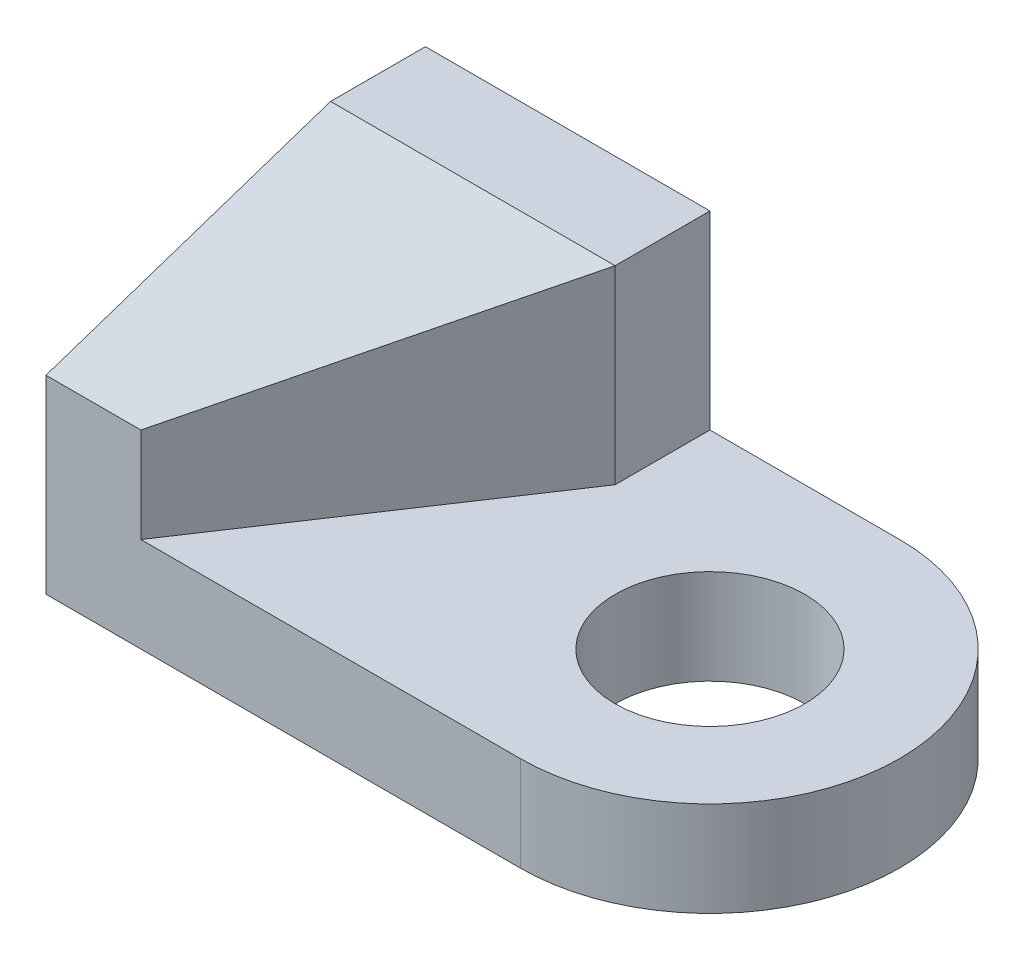
ISO-10303-21;
HEADER;
FILE_DESCRIPTION(('STEP AP214'),'2;1');
FILE_NAME('part.step','',(''),(''),'','','');
FILE_SCHEMA(('AUTOMOTIVE_DESIGN { 1 0 10303 214 1 1 1 1 }'));
ENDSEC;
DATA;
#1=APPLICATION_CONTEXT('core data for automotive mechanical design processes');
#2=APPLICATION_PROTOCOL_DEFINITION('international standard','automotive_design',2000,#1);
#3=PRODUCT_CONTEXT('',#1,'mechanical');
#4=PRODUCT('Part','Part','',(#3));
#5=PRODUCT_RELATED_PRODUCT_CATEGORY('part','',(#4));
#6=PRODUCT_DEFINITION_FORMATION('','',#4);
#7=PRODUCT_DEFINITION_CONTEXT('part definition',#1,'design');
#8=PRODUCT_DEFINITION('design','',#6,#7);
#9=PRODUCT_DEFINITION_SHAPE('','',#8);
#10=(LENGTH_UNIT() NAMED_UNIT(*) SI_UNIT(.MILLI.,.METRE.));
#11=(NAMED_UNIT(*) PLANE_ANGLE_UNIT() SI_UNIT($,.RADIAN.));
#12=(NAMED_UNIT(*) SI_UNIT($,.STERADIAN.) SOLID_ANGLE_UNIT());
#13=UNCERTAINTY_MEASURE_WITH_UNIT(LENGTH_MEASURE(1.E-05),#10,'distance_accuracy_value','');
#14=(GEOMETRIC_REPRESENTATION_CONTEXT(3) GLOBAL_UNCERTAINTY_ASSIGNED_CONTEXT((#13)) GLOBAL_UNIT_ASSIGNED_CONTEXT((#10,
#11,#12)) REPRESENTATION_CONTEXT('',''));
#15=CARTESIAN_POINT('',(0.,0.,0.));
#16=DIRECTION('',(0.,0.,1.));
#17=DIRECTION('',(1.,0.,0.));
#18=AXIS2_PLACEMENT_3D('',#15,#16,#17);
#19=CARTESIAN_POINT('',(25.,5.,10.));
#20=DIRECTION('',(0.,-1.,0.));
#21=DIRECTION('',(0.,0.,-1.));
#22=AXIS2_PLACEMENT_3D('',#19,#20,#21);
#23=PLANE('',#22);
#24=CARTESIAN_POINT('',(25.,5.,10.));
#25=DIRECTION('',(0.,1.,0.));
#26=DIRECTION('',(0.,0.,1.));
#27=AXIS2_PLACEMENT_3D('',#24,#25,#26);
#28=CIRCLE('',#27,5.);
#29=CARTESIAN_POINT('',(25.,5.,15.));
#30=VERTEX_POINT('',#29);
#31=EDGE_CURVE('E128',#30,#30,#28,.T.);
#32=ORIENTED_EDGE('',*,*,#31,.F.);
#33=EDGE_LOOP('',(#32));
#34=FACE_BOUND('',#33,.T.);
#35=DIRECTION('',(0.554700196225229,0.,-0.832050294337844));
#36=VECTOR('',#35,1.);
#37=CARTESIAN_POINT('',(15.,5.,5.));
#38=LINE('',#37,#36);
#39=CARTESIAN_POINT('',(5.,5.,20.));
#40=VERTEX_POINT('',#39);
#41=CARTESIAN_POINT('',(15.,5.,5.));
#42=VERTEX_POINT('',#41);
#43=EDGE_CURVE('E114',#40,#42,#38,.T.);
#44=ORIENTED_EDGE('',*,*,#43,.F.);
#45=DIRECTION('',(1.,0.,0.));
#46=VECTOR('',#45,1.);
#47=CARTESIAN_POINT('',(0.,5.,20.));
#48=LINE('',#47,#46);
#49=CARTESIAN_POINT('',(25.,5.,20.));
#50=VERTEX_POINT('',#49);
#51=EDGE_CURVE('E134',#40,#50,#48,.T.);
#52=ORIENTED_EDGE('',*,*,#51,.T.);
#53=CARTESIAN_POINT('',(25.,5.,10.));
#54=DIRECTION('',(0.,1.,0.));
#55=DIRECTION('',(0.,0.,-1.));
#56=AXIS2_PLACEMENT_3D('',#53,#54,#55);
#57=CIRCLE('',#56,10.);
#58=CARTESIAN_POINT('',(25.,5.,0.));
#59=VERTEX_POINT('',#58);
#60=EDGE_CURVE('E136',#50,#59,#57,.T.);
#61=ORIENTED_EDGE('',*,*,#60,.T.);
#62=DIRECTION('',(-1.,0.,0.));
#63=VECTOR('',#62,1.);
#64=CARTESIAN_POINT('',(0.,5.,0.));
#65=LINE('',#64,#63);
#66=CARTESIAN_POINT('',(15.,5.,0.));
#67=VERTEX_POINT('',#66);
#68=EDGE_CURVE('E139',#59,#67,#65,.T.);
#69=ORIENTED_EDGE('',*,*,#68,.T.);
#70=DIRECTION('',(0.,0.,-1.));
#71=VECTOR('',#70,1.);
#72=CARTESIAN_POINT('',(15.,5.,5.));
#73=LINE('',#72,#71);
#74=EDGE_CURVE('E55',#42,#67,#73,.T.);
#75=ORIENTED_EDGE('',*,*,#74,.F.);
#76=EDGE_LOOP('',(#44,#52,#61,#69,#75));
#77=FACE_BOUND('',#76,.T.);
#78=ADVANCED_FACE('F33',(#34,#77),#23,.F.);
#79=CARTESIAN_POINT('',(25.,0.,10.));
#80=DIRECTION('',(0.,-1.,0.));
#81=DIRECTION('',(0.,0.,-1.));
#82=AXIS2_PLACEMENT_3D('',#79,#80,#81);
#83=PLANE('',#82);
#84=DIRECTION('',(0.,0.,1.));
#85=VECTOR('',#84,1.);
#86=CARTESIAN_POINT('',(0.,0.,0.));
#87=LINE('',#86,#85);
#88=CARTESIAN_POINT('',(0.,0.,0.));
#89=VERTEX_POINT('',#88);
#90=CARTESIAN_POINT('',(0.,0.,20.));
#91=VERTEX_POINT('',#90);
#92=EDGE_CURVE('E131',#89,#91,#87,.T.);
#93=ORIENTED_EDGE('',*,*,#92,.F.);
#94=DIRECTION('',(-1.,0.,0.));
#95=VECTOR('',#94,1.);
#96=CARTESIAN_POINT('',(0.,0.,0.));
#97=LINE('',#96,#95);
#98=CARTESIAN_POINT('',(25.,0.,0.));
#99=VERTEX_POINT('',#98);
#100=EDGE_CURVE('E137',#99,#89,#97,.T.);
#101=ORIENTED_EDGE('',*,*,#100,.F.);
#102=CARTESIAN_POINT('',(25.,0.,10.));
#103=DIRECTION('',(0.,1.,0.));
#104=DIRECTION('',(0.,0.,-1.));
#105=AXIS2_PLACEMENT_3D('',#102,#103,#104);
#106=CIRCLE('',#105,10.);
#107=CARTESIAN_POINT('',(25.,0.,20.));
#108=VERTEX_POINT('',#107);
#109=EDGE_CURVE('E145',#108,#99,#106,.T.);
#110=ORIENTED_EDGE('',*,*,#109,.F.);
#111=DIRECTION('',(1.,0.,0.));
#112=VECTOR('',#111,1.);
#113=CARTESIAN_POINT('',(0.,0.,20.));
#114=LINE('',#113,#112);
#115=EDGE_CURVE('E143',#91,#108,#114,.T.);
#116=ORIENTED_EDGE('',*,*,#115,.F.);
#117=EDGE_LOOP('',(#93,#101,#110,#116));
#118=FACE_BOUND('',#117,.T.);
#119=CARTESIAN_POINT('',(25.,0.,10.));
#120=DIRECTION('',(0.,1.,0.));
#121=DIRECTION('',(0.,0.,1.));
#122=AXIS2_PLACEMENT_3D('',#119,#120,#121);
#123=CIRCLE('',#122,5.);
#124=CARTESIAN_POINT('',(25.,0.,15.));
#125=VERTEX_POINT('',#124);
#126=EDGE_CURVE('E127',#125,#125,#123,.T.);
#127=ORIENTED_EDGE('',*,*,#126,.T.);
#128=EDGE_LOOP('',(#127));
#129=FACE_BOUND('',#128,.T.);
#130=ADVANCED_FACE('F161',(#118,#129),#83,.T.);
#131=CARTESIAN_POINT('',(0.,5.,0.));
#132=DIRECTION('',(1.,0.,0.));
#133=DIRECTION('',(0.,0.,-1.));
#134=AXIS2_PLACEMENT_3D('',#131,#132,#133);
#135=PLANE('',#134);
#136=DIRECTION('',(0.,-1.,0.));
#137=VECTOR('',#136,1.);
#138=CARTESIAN_POINT('',(0.,5.,20.));
#139=LINE('',#138,#137);
#140=CARTESIAN_POINT('',(0.,10.,20.));
#141=VERTEX_POINT('',#140);
#142=EDGE_CURVE('E41',#141,#91,#139,.T.);
#143=ORIENTED_EDGE('',*,*,#142,.F.);
#144=DIRECTION('',(0.,-0.316227766016838,0.948683298050514));
#145=VECTOR('',#144,1.);
#146=CARTESIAN_POINT('',(0.,15.,5.));
#147=LINE('',#146,#145);
#148=CARTESIAN_POINT('',(0.,15.,5.));
#149=VERTEX_POINT('',#148);
#150=EDGE_CURVE('E95',#149,#141,#147,.T.);
#151=ORIENTED_EDGE('',*,*,#150,.F.);
#152=DIRECTION('',(0.,0.,1.));
#153=VECTOR('',#152,1.);
#154=CARTESIAN_POINT('',(0.,15.,5.));
#155=LINE('',#154,#153);
#156=CARTESIAN_POINT('',(0.,15.,0.));
#157=VERTEX_POINT('',#156);
#158=EDGE_CURVE('E104',#157,#149,#155,.T.);
#159=ORIENTED_EDGE('',*,*,#158,.F.);
#160=DIRECTION('',(0.,-1.,0.));
#161=VECTOR('',#160,1.);
#162=CARTESIAN_POINT('',(0.,5.,0.));
#163=LINE('',#162,#161);
#164=EDGE_CURVE('E141',#157,#89,#163,.T.);
#165=ORIENTED_EDGE('',*,*,#164,.T.);
#166=ORIENTED_EDGE('',*,*,#92,.T.);
#167=EDGE_LOOP('',(#143,#151,#159,#165,#166));
#168=FACE_BOUND('',#167,.T.);
#169=ADVANCED_FACE('F35',(#168),#135,.F.);
#170=CARTESIAN_POINT('',(0.,5.,20.));
#171=DIRECTION('',(0.,0.,-1.));
#172=DIRECTION('',(-1.,0.,0.));
#173=AXIS2_PLACEMENT_3D('',#170,#171,#172);
#174=PLANE('',#173);
#175=DIRECTION('',(0.,1.,0.));
#176=VECTOR('',#175,1.);
#177=CARTESIAN_POINT('',(5.,5.,20.));
#178=LINE('',#177,#176);
#179=CARTESIAN_POINT('',(5.,10.,20.));
#180=VERTEX_POINT('',#179);
#181=EDGE_CURVE('E124',#40,#180,#178,.T.);
#182=ORIENTED_EDGE('',*,*,#181,.T.);
#183=DIRECTION('',(-1.,0.,0.));
#184=VECTOR('',#183,1.);
#185=CARTESIAN_POINT('',(22.,10.,20.));
#186=LINE('',#185,#184);
#187=EDGE_CURVE('E48',#180,#141,#186,.T.);
#188=ORIENTED_EDGE('',*,*,#187,.T.);
#189=ORIENTED_EDGE('',*,*,#142,.T.);
#190=ORIENTED_EDGE('',*,*,#115,.T.);
#191=DIRECTION('',(0.,-1.,0.));
#192=VECTOR('',#191,1.);
#193=CARTESIAN_POINT('',(25.,5.,20.));
#194=LINE('',#193,#192);
#195=EDGE_CURVE('E152',#50,#108,#194,.T.);
#196=ORIENTED_EDGE('',*,*,#195,.F.);
#197=ORIENTED_EDGE('',*,*,#51,.F.);
#198=EDGE_LOOP('',(#182,#188,#189,#190,#196,#197));
#199=FACE_BOUND('',#198,.T.);
#200=ADVANCED_FACE('F156',(#199),#174,.F.);
#201=CARTESIAN_POINT('',(25.,5.,10.));
#202=DIRECTION('',(0.,-1.,0.));
#203=DIRECTION('',(0.,0.,-1.));
#204=AXIS2_PLACEMENT_3D('',#201,#202,#203);
#205=CYLINDRICAL_SURFACE('',#204,10.);
#206=ORIENTED_EDGE('',*,*,#109,.T.);
#207=DIRECTION('',(0.,-1.,0.));
#208=VECTOR('',#207,1.);
#209=CARTESIAN_POINT('',(25.,5.,0.));
#210=LINE('',#209,#208);
#211=EDGE_CURVE('E149',#59,#99,#210,.T.);
#212=ORIENTED_EDGE('',*,*,#211,.F.);
#213=ORIENTED_EDGE('',*,*,#60,.F.);
#214=ORIENTED_EDGE('',*,*,#195,.T.);
#215=EDGE_LOOP('',(#206,#212,#213,#214));
#216=FACE_BOUND('',#215,.T.);
#217=ADVANCED_FACE('F170',(#216),#205,.T.);
#218=CARTESIAN_POINT('',(0.,5.,0.));
#219=DIRECTION('',(0.,0.,1.));
#220=DIRECTION('',(1.,0.,0.));
#221=AXIS2_PLACEMENT_3D('',#218,#219,#220);
#222=PLANE('',#221);
#223=ORIENTED_EDGE('',*,*,#100,.T.);
#224=ORIENTED_EDGE('',*,*,#164,.F.);
#225=DIRECTION('',(-1.,0.,0.));
#226=VECTOR('',#225,1.);
#227=CARTESIAN_POINT('',(0.,15.,0.));
#228=LINE('',#227,#226);
#229=CARTESIAN_POINT('',(15.,15.,0.));
#230=VERTEX_POINT('',#229);
#231=EDGE_CURVE('E110',#230,#157,#228,.T.);
#232=ORIENTED_EDGE('',*,*,#231,.F.);
#233=DIRECTION('',(0.,-1.,0.));
#234=VECTOR('',#233,1.);
#235=CARTESIAN_POINT('',(15.,15.,0.));
#236=LINE('',#235,#234);
#237=EDGE_CURVE('E118',#230,#67,#236,.T.);
#238=ORIENTED_EDGE('',*,*,#237,.T.);
#239=ORIENTED_EDGE('',*,*,#68,.F.);
#240=ORIENTED_EDGE('',*,*,#211,.T.);
#241=EDGE_LOOP('',(#223,#224,#232,#238,#239,#240));
#242=FACE_BOUND('',#241,.T.);
#243=ADVANCED_FACE('F165',(#242),#222,.F.);
#244=CARTESIAN_POINT('',(25.,5.,10.));
#245=DIRECTION('',(0.,-1.,0.));
#246=DIRECTION('',(0.,0.,-1.));
#247=AXIS2_PLACEMENT_3D('',#244,#245,#246);
#248=CYLINDRICAL_SURFACE('',#247,5.);
#249=ORIENTED_EDGE('',*,*,#31,.T.);
#250=EDGE_LOOP('',(#249));
#251=FACE_BOUND('',#250,.T.);
#252=ORIENTED_EDGE('',*,*,#126,.F.);
#253=EDGE_LOOP('',(#252));
#254=FACE_BOUND('',#253,.T.);
#255=ADVANCED_FACE('F181',(#251,#254),#248,.F.);
#256=CARTESIAN_POINT('',(15.,15.,5.));
#257=DIRECTION('',(-1.,0.,0.));
#258=DIRECTION('',(0.,0.,1.));
#259=AXIS2_PLACEMENT_3D('',#256,#257,#258);
#260=PLANE('',#259);
#261=ORIENTED_EDGE('',*,*,#74,.T.);
#262=ORIENTED_EDGE('',*,*,#237,.F.);
#263=DIRECTION('',(0.,0.,-1.));
#264=VECTOR('',#263,1.);
#265=CARTESIAN_POINT('',(15.,15.,5.));
#266=LINE('',#265,#264);
#267=CARTESIAN_POINT('',(15.,15.,5.));
#268=VERTEX_POINT('',#267);
#269=EDGE_CURVE('E111',#268,#230,#266,.T.);
#270=ORIENTED_EDGE('',*,*,#269,.F.);
#271=DIRECTION('',(0.,-1.,0.));
#272=VECTOR('',#271,1.);
#273=CARTESIAN_POINT('',(15.,15.,5.));
#274=LINE('',#273,#272);
#275=EDGE_CURVE('E122',#268,#42,#274,.T.);
#276=ORIENTED_EDGE('',*,*,#275,.T.);
#277=EDGE_LOOP('',(#261,#262,#270,#276));
#278=FACE_BOUND('',#277,.T.);
#279=ADVANCED_FACE('F178',(#278),#260,.F.);
#280=CARTESIAN_POINT('',(0.,15.,0.));
#281=DIRECTION('',(0.,-1.,0.));
#282=DIRECTION('',(0.,0.,-1.));
#283=AXIS2_PLACEMENT_3D('',#280,#281,#282);
#284=PLANE('',#283);
#285=ORIENTED_EDGE('',*,*,#158,.T.);
#286=DIRECTION('',(-1.,0.,0.));
#287=VECTOR('',#286,1.);
#288=CARTESIAN_POINT('',(22.,15.,5.));
#289=LINE('',#288,#287);
#290=EDGE_CURVE('E92',#268,#149,#289,.T.);
#291=ORIENTED_EDGE('',*,*,#290,.F.);
#292=ORIENTED_EDGE('',*,*,#269,.T.);
#293=ORIENTED_EDGE('',*,*,#231,.T.);
#294=EDGE_LOOP('',(#285,#291,#292,#293));
#295=FACE_BOUND('',#294,.T.);
#296=ADVANCED_FACE('F108',(#295),#284,.F.);
#297=CARTESIAN_POINT('',(15.,15.,5.));
#298=DIRECTION('',(-0.832050294337844,0.,-0.554700196225229));
#299=DIRECTION('',(-0.554700196225229,0.,0.832050294337844));
#300=AXIS2_PLACEMENT_3D('',#297,#298,#299);
#301=PLANE('',#300);
#302=ORIENTED_EDGE('',*,*,#275,.F.);
#303=DIRECTION('',(-0.534522483824849,-0.267261241912424,0.801783725737273));
#304=VECTOR('',#303,1.);
#305=CARTESIAN_POINT('',(15.,15.,5.));
#306=LINE('',#305,#304);
#307=EDGE_CURVE('E11',#268,#180,#306,.T.);
#308=ORIENTED_EDGE('',*,*,#307,.T.);
#309=ORIENTED_EDGE('',*,*,#181,.F.);
#310=ORIENTED_EDGE('',*,*,#43,.T.);
#311=EDGE_LOOP('',(#302,#308,#309,#310));
#312=FACE_BOUND('',#311,.T.);
#313=ADVANCED_FACE('F176',(#312),#301,.F.);
#314=CARTESIAN_POINT('',(22.,15.,5.));
#315=DIRECTION('',(0.,-0.948683298050514,-0.316227766016838));
#316=DIRECTION('',(0.,0.316227766016838,-0.948683298050514));
#317=AXIS2_PLACEMENT_3D('',#314,#315,#316);
#318=PLANE('',#317);
#319=ORIENTED_EDGE('',*,*,#290,.T.);
#320=ORIENTED_EDGE('',*,*,#150,.T.);
#321=ORIENTED_EDGE('',*,*,#187,.F.);
#322=ORIENTED_EDGE('',*,*,#307,.F.);
#323=EDGE_LOOP('',(#319,#320,#321,#322));
#324=FACE_BOUND('',#323,.T.);
#325=ADVANCED_FACE('F94',(#324),#318,.F.);
#326=CLOSED_SHELL('',(#78,#130,#169,#200,#217,#243,#255,#279,#296,#313,#325));
#327=MANIFOLD_SOLID_BREP('B2',#326);
#328=ADVANCED_BREP_SHAPE_REPRESENTATION('',(#18,#327),#14);
#329=SHAPE_DEFINITION_REPRESENTATION(#9,#328);
ENDSEC;
END-ISO-10303-21;
